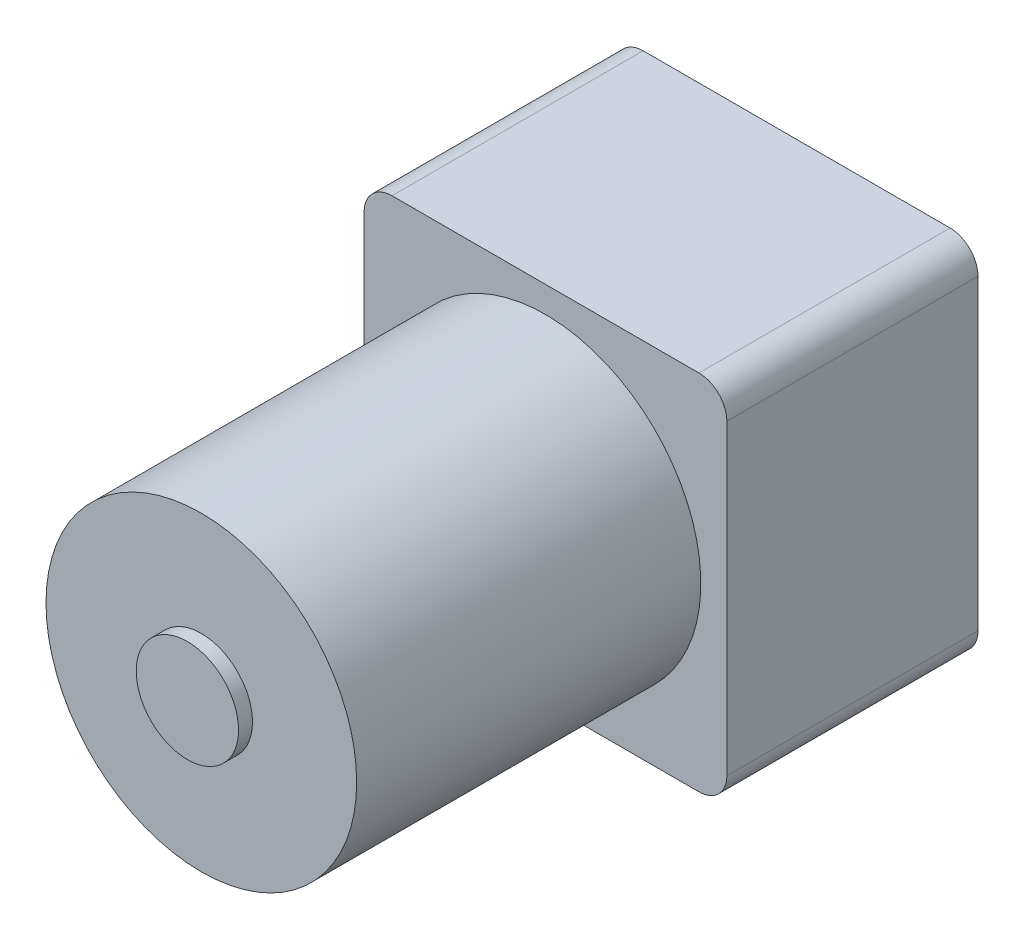
ISO-10303-21;
HEADER;
FILE_DESCRIPTION(('STEP AP214'),'2;1');
FILE_NAME('part.step','',(''),(''),'','','');
FILE_SCHEMA(('AUTOMOTIVE_DESIGN { 1 0 10303 214 1 1 1 1 }'));
ENDSEC;
DATA;
#1=APPLICATION_CONTEXT('core data for automotive mechanical design processes');
#2=APPLICATION_PROTOCOL_DEFINITION('international standard','automotive_design',2000,#1);
#3=PRODUCT_CONTEXT('',#1,'mechanical');
#4=PRODUCT('Part','Part','',(#3));
#5=PRODUCT_RELATED_PRODUCT_CATEGORY('part','',(#4));
#6=PRODUCT_DEFINITION_FORMATION('','',#4);
#7=PRODUCT_DEFINITION_CONTEXT('part definition',#1,'design');
#8=PRODUCT_DEFINITION('design','',#6,#7);
#9=PRODUCT_DEFINITION_SHAPE('','',#8);
#10=(LENGTH_UNIT() NAMED_UNIT(*) SI_UNIT(.MILLI.,.METRE.));
#11=(NAMED_UNIT(*) PLANE_ANGLE_UNIT() SI_UNIT($,.RADIAN.));
#12=(NAMED_UNIT(*) SI_UNIT($,.STERADIAN.) SOLID_ANGLE_UNIT());
#13=UNCERTAINTY_MEASURE_WITH_UNIT(LENGTH_MEASURE(1.E-05),#10,'distance_accuracy_value','');
#14=(GEOMETRIC_REPRESENTATION_CONTEXT(3) GLOBAL_UNCERTAINTY_ASSIGNED_CONTEXT((#13)) GLOBAL_UNIT_ASSIGNED_CONTEXT((#10,
#11,#12)) REPRESENTATION_CONTEXT('',''));
#15=CARTESIAN_POINT('',(0.,0.,0.));
#16=DIRECTION('',(0.,0.,1.));
#17=DIRECTION('',(1.,0.,0.));
#18=AXIS2_PLACEMENT_3D('',#15,#16,#17);
#19=CARTESIAN_POINT('',(-4.76353973810178,-2.44882978723404,-1.5));
#20=DIRECTION('',(0.,0.,-1.));
#21=DIRECTION('',(-1.,0.,0.));
#22=AXIS2_PLACEMENT_3D('',#19,#20,#21);
#23=PLANE('',#22);
#24=CARTESIAN_POINT('',(-4.76353973810178,-2.44882978723404,-1.5));
#25=DIRECTION('',(0.,0.,-1.));
#26=DIRECTION('',(-1.,0.,0.));
#27=AXIS2_PLACEMENT_3D('',#24,#25,#26);
#28=CIRCLE('',#27,5.5);
#29=CARTESIAN_POINT('',(-10.2635397381018,-2.44882978723404,-1.5));
#30=VERTEX_POINT('',#29);
#31=EDGE_CURVE('E212',#30,#30,#28,.T.);
#32=ORIENTED_EDGE('',*,*,#31,.T.);
#33=EDGE_LOOP('',(#32));
#34=FACE_BOUND('',#33,.T.);
#35=CARTESIAN_POINT('',(-4.76353973810177,-2.44882978723404,-1.5));
#36=DIRECTION('',(0.,0.,-1.));
#37=DIRECTION('',(-1.,0.,0.));
#38=AXIS2_PLACEMENT_3D('',#35,#36,#37);
#39=CIRCLE('',#38,2.);
#40=CARTESIAN_POINT('',(-6.76353973810177,-2.44882978723404,-1.5));
#41=VERTEX_POINT('',#40);
#42=EDGE_CURVE('E221',#41,#41,#39,.T.);
#43=ORIENTED_EDGE('',*,*,#42,.F.);
#44=EDGE_LOOP('',(#43));
#45=FACE_BOUND('',#44,.T.);
#46=ADVANCED_FACE('F30',(#34,#45),#23,.T.);
#47=CARTESIAN_POINT('',(11.7364602618982,14.051170212766,0.));
#48=DIRECTION('',(0.,0.,-1.));
#49=DIRECTION('',(-1.,0.,0.));
#50=AXIS2_PLACEMENT_3D('',#47,#48,#49);
#51=PLANE('',#50);
#52=CARTESIAN_POINT('',(11.7364602618982,14.051170212766,0.));
#53=DIRECTION('',(0.,0.,1.));
#54=DIRECTION('',(-1.,0.,0.));
#55=AXIS2_PLACEMENT_3D('',#52,#53,#54);
#56=CIRCLE('',#55,3.);
#57=CARTESIAN_POINT('',(14.7364602618982,14.0511702127659,0.));
#58=VERTEX_POINT('',#57);
#59=CARTESIAN_POINT('',(11.7364602618982,17.051170212766,0.));
#60=VERTEX_POINT('',#59);
#61=EDGE_CURVE('E129',#58,#60,#56,.T.);
#62=ORIENTED_EDGE('',*,*,#61,.F.);
#63=DIRECTION('',(0.,1.,0.));
#64=VECTOR('',#63,1.);
#65=CARTESIAN_POINT('',(14.7364602618982,14.0511702127659,0.));
#66=LINE('',#65,#64);
#67=CARTESIAN_POINT('',(14.7364602618982,-18.948829787234,0.));
#68=VERTEX_POINT('',#67);
#69=EDGE_CURVE('E82',#68,#58,#66,.T.);
#70=ORIENTED_EDGE('',*,*,#69,.F.);
#71=CARTESIAN_POINT('',(11.7364602618982,-18.948829787234,0.));
#72=DIRECTION('',(0.,0.,1.));
#73=DIRECTION('',(1.,0.,0.));
#74=AXIS2_PLACEMENT_3D('',#71,#72,#73);
#75=CIRCLE('',#74,3.);
#76=CARTESIAN_POINT('',(11.7364602618982,-21.948829787234,0.));
#77=VERTEX_POINT('',#76);
#78=EDGE_CURVE('E76',#77,#68,#75,.T.);
#79=ORIENTED_EDGE('',*,*,#78,.F.);
#80=DIRECTION('',(1.,0.,0.));
#81=VECTOR('',#80,1.);
#82=CARTESIAN_POINT('',(-21.2635397381018,-21.948829787234,0.));
#83=LINE('',#82,#81);
#84=CARTESIAN_POINT('',(-21.2635397381018,-21.948829787234,0.));
#85=VERTEX_POINT('',#84);
#86=EDGE_CURVE('E119',#85,#77,#83,.T.);
#87=ORIENTED_EDGE('',*,*,#86,.F.);
#88=CARTESIAN_POINT('',(-21.2635397381018,-18.948829787234,0.));
#89=DIRECTION('',(0.,0.,1.));
#90=DIRECTION('',(1.,0.,0.));
#91=AXIS2_PLACEMENT_3D('',#88,#89,#90);
#92=CIRCLE('',#91,3.);
#93=CARTESIAN_POINT('',(-24.2635397381018,-18.948829787234,0.));
#94=VERTEX_POINT('',#93);
#95=EDGE_CURVE('E139',#94,#85,#92,.T.);
#96=ORIENTED_EDGE('',*,*,#95,.F.);
#97=DIRECTION('',(0.,-1.,0.));
#98=VECTOR('',#97,1.);
#99=CARTESIAN_POINT('',(-24.2635397381018,14.0511702127659,0.));
#100=LINE('',#99,#98);
#101=CARTESIAN_POINT('',(-24.2635397381018,14.0511702127659,0.));
#102=VERTEX_POINT('',#101);
#103=EDGE_CURVE('E137',#102,#94,#100,.T.);
#104=ORIENTED_EDGE('',*,*,#103,.F.);
#105=CARTESIAN_POINT('',(-21.2635397381018,14.051170212766,0.));
#106=DIRECTION('',(0.,0.,1.));
#107=DIRECTION('',(1.,0.,0.));
#108=AXIS2_PLACEMENT_3D('',#105,#106,#107);
#109=CIRCLE('',#108,3.);
#110=CARTESIAN_POINT('',(-21.2635397381018,17.051170212766,0.));
#111=VERTEX_POINT('',#110);
#112=EDGE_CURVE('E135',#111,#102,#109,.T.);
#113=ORIENTED_EDGE('',*,*,#112,.F.);
#114=DIRECTION('',(-1.,0.,0.));
#115=VECTOR('',#114,1.);
#116=CARTESIAN_POINT('',(-21.2635397381018,17.051170212766,0.));
#117=LINE('',#116,#115);
#118=EDGE_CURVE('E132',#60,#111,#117,.T.);
#119=ORIENTED_EDGE('',*,*,#118,.F.);
#120=EDGE_LOOP('',(#62,#70,#79,#87,#96,#104,#113,#119));
#121=FACE_BOUND('',#120,.T.);
#122=CARTESIAN_POINT('',(11.2364602618982,13.551170212766,0.));
#123=DIRECTION('',(0.,0.,-1.));
#124=DIRECTION('',(-1.,0.,0.));
#125=AXIS2_PLACEMENT_3D('',#122,#123,#124);
#126=CIRCLE('',#125,1.35);
#127=CARTESIAN_POINT('',(9.88646026189822,13.551170212766,0.));
#128=VERTEX_POINT('',#127);
#129=EDGE_CURVE('E191',#128,#128,#126,.T.);
#130=ORIENTED_EDGE('',*,*,#129,.F.);
#131=EDGE_LOOP('',(#130));
#132=FACE_BOUND('',#131,.T.);
#133=CARTESIAN_POINT('',(-20.7635397381018,13.551170212766,0.));
#134=DIRECTION('',(0.,0.,-1.));
#135=DIRECTION('',(-1.,0.,0.));
#136=AXIS2_PLACEMENT_3D('',#133,#134,#135);
#137=CIRCLE('',#136,1.35);
#138=CARTESIAN_POINT('',(-22.1135397381018,13.551170212766,0.));
#139=VERTEX_POINT('',#138);
#140=EDGE_CURVE('E197',#139,#139,#137,.T.);
#141=ORIENTED_EDGE('',*,*,#140,.F.);
#142=EDGE_LOOP('',(#141));
#143=FACE_BOUND('',#142,.T.);
#144=CARTESIAN_POINT('',(-20.7635397381018,-18.448829787234,0.));
#145=DIRECTION('',(0.,0.,-1.));
#146=DIRECTION('',(-1.,0.,0.));
#147=AXIS2_PLACEMENT_3D('',#144,#145,#146);
#148=CIRCLE('',#147,1.35);
#149=CARTESIAN_POINT('',(-22.1135397381018,-18.448829787234,0.));
#150=VERTEX_POINT('',#149);
#151=EDGE_CURVE('E203',#150,#150,#148,.T.);
#152=ORIENTED_EDGE('',*,*,#151,.F.);
#153=EDGE_LOOP('',(#152));
#154=FACE_BOUND('',#153,.T.);
#155=CARTESIAN_POINT('',(11.2364602618982,-18.448829787234,0.));
#156=DIRECTION('',(0.,0.,-1.));
#157=DIRECTION('',(-1.,0.,0.));
#158=AXIS2_PLACEMENT_3D('',#155,#156,#157);
#159=CIRCLE('',#158,1.35);
#160=CARTESIAN_POINT('',(9.88646026189822,-18.448829787234,0.));
#161=VERTEX_POINT('',#160);
#162=EDGE_CURVE('E209',#161,#161,#159,.T.);
#163=ORIENTED_EDGE('',*,*,#162,.F.);
#164=EDGE_LOOP('',(#163));
#165=FACE_BOUND('',#164,.T.);
#166=CARTESIAN_POINT('',(-4.76353973810178,-2.44882978723404,0.));
#167=DIRECTION('',(0.,0.,-1.));
#168=DIRECTION('',(-1.,0.,0.));
#169=AXIS2_PLACEMENT_3D('',#166,#167,#168);
#170=CIRCLE('',#169,5.5);
#171=CARTESIAN_POINT('',(-10.2635397381018,-2.44882978723404,0.));
#172=VERTEX_POINT('',#171);
#173=EDGE_CURVE('E215',#172,#172,#170,.T.);
#174=ORIENTED_EDGE('',*,*,#173,.F.);
#175=EDGE_LOOP('',(#174));
#176=FACE_BOUND('',#175,.T.);
#177=ADVANCED_FACE('F162',(#121,#132,#143,#154,#165,#176),#51,.T.);
#178=CARTESIAN_POINT('',(-4.76353973810178,-2.44882978723404,64.));
#179=DIRECTION('',(0.,0.,1.));
#180=DIRECTION('',(1.,0.,0.));
#181=AXIS2_PLACEMENT_3D('',#178,#179,#180);
#182=PLANE('',#181);
#183=CARTESIAN_POINT('',(-4.76353973810178,-2.44882978723404,64.));
#184=DIRECTION('',(0.,0.,1.));
#185=DIRECTION('',(1.,0.,0.));
#186=AXIS2_PLACEMENT_3D('',#183,#184,#185);
#187=CIRCLE('',#186,16.7);
#188=CARTESIAN_POINT('',(11.9364602618982,-2.44882978723404,64.));
#189=VERTEX_POINT('',#188);
#190=EDGE_CURVE('E133',#189,#189,#187,.T.);
#191=ORIENTED_EDGE('',*,*,#190,.T.);
#192=EDGE_LOOP('',(#191));
#193=FACE_BOUND('',#192,.T.);
#194=CARTESIAN_POINT('',(-4.76353973810178,-2.44882978723404,64.));
#195=DIRECTION('',(0.,0.,1.));
#196=DIRECTION('',(1.,0.,0.));
#197=AXIS2_PLACEMENT_3D('',#194,#195,#196);
#198=CIRCLE('',#197,5.5);
#199=CARTESIAN_POINT('',(0.736460261898225,-2.44882978723404,64.));
#200=VERTEX_POINT('',#199);
#201=EDGE_CURVE('E185',#200,#200,#198,.T.);
#202=ORIENTED_EDGE('',*,*,#201,.F.);
#203=EDGE_LOOP('',(#202));
#204=FACE_BOUND('',#203,.T.);
#205=ADVANCED_FACE('F242',(#193,#204),#182,.T.);
#206=CARTESIAN_POINT('',(11.7364602618982,14.051170212766,27.));
#207=DIRECTION('',(0.,0.,-1.));
#208=DIRECTION('',(-1.,0.,0.));
#209=AXIS2_PLACEMENT_3D('',#206,#207,#208);
#210=PLANE('',#209);
#211=CARTESIAN_POINT('',(11.7364602618982,14.051170212766,27.));
#212=DIRECTION('',(0.,0.,1.));
#213=DIRECTION('',(-1.,0.,0.));
#214=AXIS2_PLACEMENT_3D('',#211,#212,#213);
#215=CIRCLE('',#214,3.);
#216=CARTESIAN_POINT('',(14.7364602618982,14.0511702127659,27.));
#217=VERTEX_POINT('',#216);
#218=CARTESIAN_POINT('',(11.7364602618982,17.051170212766,27.));
#219=VERTEX_POINT('',#218);
#220=EDGE_CURVE('E144',#217,#219,#215,.T.);
#221=ORIENTED_EDGE('',*,*,#220,.T.);
#222=DIRECTION('',(-1.,0.,0.));
#223=VECTOR('',#222,1.);
#224=CARTESIAN_POINT('',(-21.2635397381018,17.051170212766,27.));
#225=LINE('',#224,#223);
#226=CARTESIAN_POINT('',(-21.2635397381018,17.051170212766,27.));
#227=VERTEX_POINT('',#226);
#228=EDGE_CURVE('E91',#219,#227,#225,.T.);
#229=ORIENTED_EDGE('',*,*,#228,.T.);
#230=CARTESIAN_POINT('',(-21.2635397381018,14.051170212766,27.));
#231=DIRECTION('',(0.,0.,1.));
#232=DIRECTION('',(1.,0.,0.));
#233=AXIS2_PLACEMENT_3D('',#230,#231,#232);
#234=CIRCLE('',#233,3.);
#235=CARTESIAN_POINT('',(-24.2635397381018,14.0511702127659,27.));
#236=VERTEX_POINT('',#235);
#237=EDGE_CURVE('E176',#227,#236,#234,.T.);
#238=ORIENTED_EDGE('',*,*,#237,.T.);
#239=DIRECTION('',(0.,-1.,0.));
#240=VECTOR('',#239,1.);
#241=CARTESIAN_POINT('',(-24.2635397381018,14.0511702127659,27.));
#242=LINE('',#241,#240);
#243=CARTESIAN_POINT('',(-24.2635397381018,-18.948829787234,27.));
#244=VERTEX_POINT('',#243);
#245=EDGE_CURVE('E175',#236,#244,#242,.T.);
#246=ORIENTED_EDGE('',*,*,#245,.T.);
#247=CARTESIAN_POINT('',(-21.2635397381018,-18.948829787234,27.));
#248=DIRECTION('',(0.,0.,1.));
#249=DIRECTION('',(1.,0.,0.));
#250=AXIS2_PLACEMENT_3D('',#247,#248,#249);
#251=CIRCLE('',#250,3.);
#252=CARTESIAN_POINT('',(-21.2635397381018,-21.948829787234,27.));
#253=VERTEX_POINT('',#252);
#254=EDGE_CURVE('E111',#244,#253,#251,.T.);
#255=ORIENTED_EDGE('',*,*,#254,.T.);
#256=DIRECTION('',(1.,0.,0.));
#257=VECTOR('',#256,1.);
#258=CARTESIAN_POINT('',(-21.2635397381018,-21.948829787234,27.));
#259=LINE('',#258,#257);
#260=CARTESIAN_POINT('',(11.7364602618982,-21.948829787234,27.));
#261=VERTEX_POINT('',#260);
#262=EDGE_CURVE('E104',#253,#261,#259,.T.);
#263=ORIENTED_EDGE('',*,*,#262,.T.);
#264=CARTESIAN_POINT('',(11.7364602618982,-18.948829787234,27.));
#265=DIRECTION('',(0.,0.,1.));
#266=DIRECTION('',(1.,0.,0.));
#267=AXIS2_PLACEMENT_3D('',#264,#265,#266);
#268=CIRCLE('',#267,3.);
#269=CARTESIAN_POINT('',(14.7364602618982,-18.948829787234,27.));
#270=VERTEX_POINT('',#269);
#271=EDGE_CURVE('E109',#261,#270,#268,.T.);
#272=ORIENTED_EDGE('',*,*,#271,.T.);
#273=DIRECTION('',(0.,1.,0.));
#274=VECTOR('',#273,1.);
#275=CARTESIAN_POINT('',(14.7364602618982,14.0511702127659,27.));
#276=LINE('',#275,#274);
#277=EDGE_CURVE('E47',#270,#217,#276,.T.);
#278=ORIENTED_EDGE('',*,*,#277,.T.);
#279=EDGE_LOOP('',(#221,#229,#238,#246,#255,#263,#272,#278));
#280=FACE_BOUND('',#279,.T.);
#281=CARTESIAN_POINT('',(-4.76353973810178,-2.44882978723404,27.));
#282=DIRECTION('',(0.,0.,-1.));
#283=DIRECTION('',(-1.,0.,0.));
#284=AXIS2_PLACEMENT_3D('',#281,#282,#283);
#285=CIRCLE('',#284,16.7);
#286=CARTESIAN_POINT('',(-21.4635397381018,-2.44882978723404,27.));
#287=VERTEX_POINT('',#286);
#288=EDGE_CURVE('E11',#287,#287,#285,.F.);
#289=ORIENTED_EDGE('',*,*,#288,.F.);
#290=EDGE_LOOP('',(#289));
#291=FACE_BOUND('',#290,.T.);
#292=ADVANCED_FACE('F106',(#280,#291),#210,.F.);
#293=CARTESIAN_POINT('',(11.7364602618982,14.051170212766,27.));
#294=DIRECTION('',(0.,0.,-1.));
#295=DIRECTION('',(-1.,0.,0.));
#296=AXIS2_PLACEMENT_3D('',#293,#294,#295);
#297=CYLINDRICAL_SURFACE('',#296,3.);
#298=ORIENTED_EDGE('',*,*,#61,.T.);
#299=DIRECTION('',(0.,0.,-1.));
#300=VECTOR('',#299,1.);
#301=CARTESIAN_POINT('',(11.7364602618982,17.051170212766,27.));
#302=LINE('',#301,#300);
#303=EDGE_CURVE('E39',#219,#60,#302,.T.);
#304=ORIENTED_EDGE('',*,*,#303,.F.);
#305=ORIENTED_EDGE('',*,*,#220,.F.);
#306=DIRECTION('',(0.,0.,-1.));
#307=VECTOR('',#306,1.);
#308=CARTESIAN_POINT('',(14.7364602618982,14.0511702127659,27.));
#309=LINE('',#308,#307);
#310=EDGE_CURVE('E125',#217,#58,#309,.T.);
#311=ORIENTED_EDGE('',*,*,#310,.T.);
#312=EDGE_LOOP('',(#298,#304,#305,#311));
#313=FACE_BOUND('',#312,.T.);
#314=ADVANCED_FACE('F32',(#313),#297,.T.);
#315=CARTESIAN_POINT('',(-21.2635397381018,17.051170212766,27.));
#316=DIRECTION('',(0.,-1.,0.));
#317=DIRECTION('',(0.,0.,-1.));
#318=AXIS2_PLACEMENT_3D('',#315,#316,#317);
#319=PLANE('',#318);
#320=ORIENTED_EDGE('',*,*,#118,.T.);
#321=DIRECTION('',(0.,0.,-1.));
#322=VECTOR('',#321,1.);
#323=CARTESIAN_POINT('',(-21.2635397381018,17.051170212766,27.));
#324=LINE('',#323,#322);
#325=EDGE_CURVE('E154',#227,#111,#324,.T.);
#326=ORIENTED_EDGE('',*,*,#325,.F.);
#327=ORIENTED_EDGE('',*,*,#228,.F.);
#328=ORIENTED_EDGE('',*,*,#303,.T.);
#329=EDGE_LOOP('',(#320,#326,#327,#328));
#330=FACE_BOUND('',#329,.T.);
#331=ADVANCED_FACE('F157',(#330),#319,.F.);
#332=CARTESIAN_POINT('',(-21.2635397381018,14.051170212766,27.));
#333=DIRECTION('',(0.,0.,-1.));
#334=DIRECTION('',(-1.,0.,0.));
#335=AXIS2_PLACEMENT_3D('',#332,#333,#334);
#336=CYLINDRICAL_SURFACE('',#335,3.);
#337=ORIENTED_EDGE('',*,*,#112,.T.);
#338=DIRECTION('',(0.,0.,-1.));
#339=VECTOR('',#338,1.);
#340=CARTESIAN_POINT('',(-24.2635397381018,14.0511702127659,27.));
#341=LINE('',#340,#339);
#342=EDGE_CURVE('E151',#236,#102,#341,.T.);
#343=ORIENTED_EDGE('',*,*,#342,.F.);
#344=ORIENTED_EDGE('',*,*,#237,.F.);
#345=ORIENTED_EDGE('',*,*,#325,.T.);
#346=EDGE_LOOP('',(#337,#343,#344,#345));
#347=FACE_BOUND('',#346,.T.);
#348=ADVANCED_FACE('F169',(#347),#336,.T.);
#349=CARTESIAN_POINT('',(-24.2635397381018,14.0511702127659,27.));
#350=DIRECTION('',(1.,0.,0.));
#351=DIRECTION('',(0.,1.,0.));
#352=AXIS2_PLACEMENT_3D('',#349,#350,#351);
#353=PLANE('',#352);
#354=ORIENTED_EDGE('',*,*,#103,.T.);
#355=DIRECTION('',(0.,0.,-1.));
#356=VECTOR('',#355,1.);
#357=CARTESIAN_POINT('',(-24.2635397381018,-18.948829787234,27.));
#358=LINE('',#357,#356);
#359=EDGE_CURVE('E148',#244,#94,#358,.T.);
#360=ORIENTED_EDGE('',*,*,#359,.F.);
#361=ORIENTED_EDGE('',*,*,#245,.F.);
#362=ORIENTED_EDGE('',*,*,#342,.T.);
#363=EDGE_LOOP('',(#354,#360,#361,#362));
#364=FACE_BOUND('',#363,.T.);
#365=ADVANCED_FACE('F173',(#364),#353,.F.);
#366=CARTESIAN_POINT('',(-21.2635397381018,-18.948829787234,27.));
#367=DIRECTION('',(0.,0.,-1.));
#368=DIRECTION('',(-1.,0.,0.));
#369=AXIS2_PLACEMENT_3D('',#366,#367,#368);
#370=CYLINDRICAL_SURFACE('',#369,3.);
#371=ORIENTED_EDGE('',*,*,#95,.T.);
#372=DIRECTION('',(0.,0.,-1.));
#373=VECTOR('',#372,1.);
#374=CARTESIAN_POINT('',(-21.2635397381018,-21.948829787234,27.));
#375=LINE('',#374,#373);
#376=EDGE_CURVE('E120',#253,#85,#375,.T.);
#377=ORIENTED_EDGE('',*,*,#376,.F.);
#378=ORIENTED_EDGE('',*,*,#254,.F.);
#379=ORIENTED_EDGE('',*,*,#359,.T.);
#380=EDGE_LOOP('',(#371,#377,#378,#379));
#381=FACE_BOUND('',#380,.T.);
#382=ADVANCED_FACE('F305',(#381),#370,.T.);
#383=CARTESIAN_POINT('',(-21.2635397381018,-21.948829787234,27.));
#384=DIRECTION('',(0.,1.,0.));
#385=DIRECTION('',(-1.,0.,0.));
#386=AXIS2_PLACEMENT_3D('',#383,#384,#385);
#387=PLANE('',#386);
#388=ORIENTED_EDGE('',*,*,#86,.T.);
#389=DIRECTION('',(0.,0.,-1.));
#390=VECTOR('',#389,1.);
#391=CARTESIAN_POINT('',(11.7364602618982,-21.948829787234,27.));
#392=LINE('',#391,#390);
#393=EDGE_CURVE('E116',#261,#77,#392,.T.);
#394=ORIENTED_EDGE('',*,*,#393,.F.);
#395=ORIENTED_EDGE('',*,*,#262,.F.);
#396=ORIENTED_EDGE('',*,*,#376,.T.);
#397=EDGE_LOOP('',(#388,#394,#395,#396));
#398=FACE_BOUND('',#397,.T.);
#399=ADVANCED_FACE('F117',(#398),#387,.F.);
#400=CARTESIAN_POINT('',(11.7364602618982,-18.948829787234,27.));
#401=DIRECTION('',(0.,0.,-1.));
#402=DIRECTION('',(-1.,0.,0.));
#403=AXIS2_PLACEMENT_3D('',#400,#401,#402);
#404=CYLINDRICAL_SURFACE('',#403,3.);
#405=ORIENTED_EDGE('',*,*,#78,.T.);
#406=DIRECTION('',(0.,0.,-1.));
#407=VECTOR('',#406,1.);
#408=CARTESIAN_POINT('',(14.7364602618982,-18.948829787234,27.));
#409=LINE('',#408,#407);
#410=EDGE_CURVE('E121',#270,#68,#409,.T.);
#411=ORIENTED_EDGE('',*,*,#410,.F.);
#412=ORIENTED_EDGE('',*,*,#271,.F.);
#413=ORIENTED_EDGE('',*,*,#393,.T.);
#414=EDGE_LOOP('',(#405,#411,#412,#413));
#415=FACE_BOUND('',#414,.T.);
#416=ADVANCED_FACE('F123',(#415),#404,.T.);
#417=CARTESIAN_POINT('',(14.7364602618982,14.0511702127659,27.));
#418=DIRECTION('',(-1.,0.,0.));
#419=DIRECTION('',(0.,-1.,0.));
#420=AXIS2_PLACEMENT_3D('',#417,#418,#419);
#421=PLANE('',#420);
#422=ORIENTED_EDGE('',*,*,#69,.T.);
#423=ORIENTED_EDGE('',*,*,#310,.F.);
#424=ORIENTED_EDGE('',*,*,#277,.F.);
#425=ORIENTED_EDGE('',*,*,#410,.T.);
#426=EDGE_LOOP('',(#422,#423,#424,#425));
#427=FACE_BOUND('',#426,.T.);
#428=ADVANCED_FACE('F295',(#427),#421,.F.);
#429=CARTESIAN_POINT('',(-4.76353973810178,-2.44882978723404,64.));
#430=DIRECTION('',(0.,0.,-1.));
#431=DIRECTION('',(-1.,0.,0.));
#432=AXIS2_PLACEMENT_3D('',#429,#430,#431);
#433=CYLINDRICAL_SURFACE('',#432,16.7);
#434=ORIENTED_EDGE('',*,*,#190,.F.);
#435=EDGE_LOOP('',(#434));
#436=FACE_BOUND('',#435,.T.);
#437=ORIENTED_EDGE('',*,*,#288,.T.);
#438=EDGE_LOOP('',(#437));
#439=FACE_BOUND('',#438,.T.);
#440=ADVANCED_FACE('F288',(#436,#439),#433,.T.);
#441=CARTESIAN_POINT('',(-4.76353973810178,-2.44882978723404,65.5));
#442=DIRECTION('',(0.,0.,-1.));
#443=DIRECTION('',(-1.,0.,0.));
#444=AXIS2_PLACEMENT_3D('',#441,#442,#443);
#445=CYLINDRICAL_SURFACE('',#444,5.5);
#446=CARTESIAN_POINT('',(-4.76353973810178,-2.44882978723404,65.5));
#447=DIRECTION('',(0.,0.,1.));
#448=DIRECTION('',(1.,0.,0.));
#449=AXIS2_PLACEMENT_3D('',#446,#447,#448);
#450=CIRCLE('',#449,5.5);
#451=CARTESIAN_POINT('',(0.736460261898225,-2.44882978723404,65.5));
#452=VERTEX_POINT('',#451);
#453=EDGE_CURVE('E184',#452,#452,#450,.T.);
#454=ORIENTED_EDGE('',*,*,#453,.F.);
#455=EDGE_LOOP('',(#454));
#456=FACE_BOUND('',#455,.T.);
#457=ORIENTED_EDGE('',*,*,#201,.T.);
#458=EDGE_LOOP('',(#457));
#459=FACE_BOUND('',#458,.T.);
#460=ADVANCED_FACE('F284',(#456,#459),#445,.T.);
#461=CARTESIAN_POINT('',(-4.76353973810178,-2.44882978723404,65.5));
#462=DIRECTION('',(0.,0.,1.));
#463=DIRECTION('',(1.,0.,0.));
#464=AXIS2_PLACEMENT_3D('',#461,#462,#463);
#465=PLANE('',#464);
#466=ORIENTED_EDGE('',*,*,#453,.T.);
#467=EDGE_LOOP('',(#466));
#468=FACE_BOUND('',#467,.T.);
#469=ADVANCED_FACE('F280',(#468),#465,.T.);
#470=CARTESIAN_POINT('',(11.2364602618982,13.551170212766,10.));
#471=DIRECTION('',(0.,0.,-1.));
#472=DIRECTION('',(-1.,0.,0.));
#473=AXIS2_PLACEMENT_3D('',#470,#471,#472);
#474=CYLINDRICAL_SURFACE('',#473,1.35);
#475=CARTESIAN_POINT('',(11.2364602618982,13.551170212766,10.));
#476=DIRECTION('',(0.,0.,-1.));
#477=DIRECTION('',(-1.,0.,0.));
#478=AXIS2_PLACEMENT_3D('',#475,#476,#477);
#479=CIRCLE('',#478,1.35);
#480=CARTESIAN_POINT('',(9.88646026189822,13.551170212766,10.));
#481=VERTEX_POINT('',#480);
#482=EDGE_CURVE('E188',#481,#481,#479,.T.);
#483=ORIENTED_EDGE('',*,*,#482,.F.);
#484=EDGE_LOOP('',(#483));
#485=FACE_BOUND('',#484,.T.);
#486=ORIENTED_EDGE('',*,*,#129,.T.);
#487=EDGE_LOOP('',(#486));
#488=FACE_BOUND('',#487,.T.);
#489=ADVANCED_FACE('F276',(#485,#488),#474,.F.);
#490=CARTESIAN_POINT('',(11.2364602618982,13.551170212766,10.));
#491=DIRECTION('',(0.,0.,-1.));
#492=DIRECTION('',(-1.,0.,0.));
#493=AXIS2_PLACEMENT_3D('',#490,#491,#492);
#494=PLANE('',#493);
#495=ORIENTED_EDGE('',*,*,#482,.T.);
#496=EDGE_LOOP('',(#495));
#497=FACE_BOUND('',#496,.T.);
#498=ADVANCED_FACE('F272',(#497),#494,.T.);
#499=CARTESIAN_POINT('',(-20.7635397381018,13.551170212766,10.));
#500=DIRECTION('',(0.,0.,-1.));
#501=DIRECTION('',(-1.,0.,0.));
#502=AXIS2_PLACEMENT_3D('',#499,#500,#501);
#503=CYLINDRICAL_SURFACE('',#502,1.35);
#504=CARTESIAN_POINT('',(-20.7635397381018,13.551170212766,10.));
#505=DIRECTION('',(0.,0.,-1.));
#506=DIRECTION('',(-1.,0.,0.));
#507=AXIS2_PLACEMENT_3D('',#504,#505,#506);
#508=CIRCLE('',#507,1.35);
#509=CARTESIAN_POINT('',(-22.1135397381018,13.551170212766,10.));
#510=VERTEX_POINT('',#509);
#511=EDGE_CURVE('E194',#510,#510,#508,.T.);
#512=ORIENTED_EDGE('',*,*,#511,.F.);
#513=EDGE_LOOP('',(#512));
#514=FACE_BOUND('',#513,.T.);
#515=ORIENTED_EDGE('',*,*,#140,.T.);
#516=EDGE_LOOP('',(#515));
#517=FACE_BOUND('',#516,.T.);
#518=ADVANCED_FACE('F268',(#514,#517),#503,.F.);
#519=CARTESIAN_POINT('',(-20.7635397381018,13.551170212766,10.));
#520=DIRECTION('',(0.,0.,-1.));
#521=DIRECTION('',(-1.,0.,0.));
#522=AXIS2_PLACEMENT_3D('',#519,#520,#521);
#523=PLANE('',#522);
#524=ORIENTED_EDGE('',*,*,#511,.T.);
#525=EDGE_LOOP('',(#524));
#526=FACE_BOUND('',#525,.T.);
#527=ADVANCED_FACE('F264',(#526),#523,.T.);
#528=CARTESIAN_POINT('',(-20.7635397381018,-18.448829787234,10.));
#529=DIRECTION('',(0.,0.,-1.));
#530=DIRECTION('',(-1.,0.,0.));
#531=AXIS2_PLACEMENT_3D('',#528,#529,#530);
#532=CYLINDRICAL_SURFACE('',#531,1.35);
#533=CARTESIAN_POINT('',(-20.7635397381018,-18.448829787234,10.));
#534=DIRECTION('',(0.,0.,-1.));
#535=DIRECTION('',(-1.,0.,0.));
#536=AXIS2_PLACEMENT_3D('',#533,#534,#535);
#537=CIRCLE('',#536,1.35);
#538=CARTESIAN_POINT('',(-22.1135397381018,-18.448829787234,10.));
#539=VERTEX_POINT('',#538);
#540=EDGE_CURVE('E200',#539,#539,#537,.T.);
#541=ORIENTED_EDGE('',*,*,#540,.F.);
#542=EDGE_LOOP('',(#541));
#543=FACE_BOUND('',#542,.T.);
#544=ORIENTED_EDGE('',*,*,#151,.T.);
#545=EDGE_LOOP('',(#544));
#546=FACE_BOUND('',#545,.T.);
#547=ADVANCED_FACE('F260',(#543,#546),#532,.F.);
#548=CARTESIAN_POINT('',(-20.7635397381018,-18.448829787234,10.));
#549=DIRECTION('',(0.,0.,-1.));
#550=DIRECTION('',(-1.,0.,0.));
#551=AXIS2_PLACEMENT_3D('',#548,#549,#550);
#552=PLANE('',#551);
#553=ORIENTED_EDGE('',*,*,#540,.T.);
#554=EDGE_LOOP('',(#553));
#555=FACE_BOUND('',#554,.T.);
#556=ADVANCED_FACE('F256',(#555),#552,.T.);
#557=CARTESIAN_POINT('',(11.2364602618982,-18.448829787234,10.));
#558=DIRECTION('',(0.,0.,-1.));
#559=DIRECTION('',(-1.,0.,0.));
#560=AXIS2_PLACEMENT_3D('',#557,#558,#559);
#561=CYLINDRICAL_SURFACE('',#560,1.35);
#562=CARTESIAN_POINT('',(11.2364602618982,-18.448829787234,10.));
#563=DIRECTION('',(0.,0.,-1.));
#564=DIRECTION('',(-1.,0.,0.));
#565=AXIS2_PLACEMENT_3D('',#562,#563,#564);
#566=CIRCLE('',#565,1.35);
#567=CARTESIAN_POINT('',(9.88646026189822,-18.448829787234,10.));
#568=VERTEX_POINT('',#567);
#569=EDGE_CURVE('E206',#568,#568,#566,.T.);
#570=ORIENTED_EDGE('',*,*,#569,.F.);
#571=EDGE_LOOP('',(#570));
#572=FACE_BOUND('',#571,.T.);
#573=ORIENTED_EDGE('',*,*,#162,.T.);
#574=EDGE_LOOP('',(#573));
#575=FACE_BOUND('',#574,.T.);
#576=ADVANCED_FACE('F252',(#572,#575),#561,.F.);
#577=CARTESIAN_POINT('',(11.2364602618982,-18.448829787234,10.));
#578=DIRECTION('',(0.,0.,-1.));
#579=DIRECTION('',(-1.,0.,0.));
#580=AXIS2_PLACEMENT_3D('',#577,#578,#579);
#581=PLANE('',#580);
#582=ORIENTED_EDGE('',*,*,#569,.T.);
#583=EDGE_LOOP('',(#582));
#584=FACE_BOUND('',#583,.T.);
#585=ADVANCED_FACE('F248',(#584),#581,.T.);
#586=CARTESIAN_POINT('',(-4.76353973810178,-2.44882978723404,-1.5));
#587=DIRECTION('',(0.,0.,1.));
#588=DIRECTION('',(1.,0.,0.));
#589=AXIS2_PLACEMENT_3D('',#586,#587,#588);
#590=CYLINDRICAL_SURFACE('',#589,5.5);
#591=ORIENTED_EDGE('',*,*,#31,.F.);
#592=EDGE_LOOP('',(#591));
#593=FACE_BOUND('',#592,.T.);
#594=ORIENTED_EDGE('',*,*,#173,.T.);
#595=EDGE_LOOP('',(#594));
#596=FACE_BOUND('',#595,.T.);
#597=ADVANCED_FACE('F232',(#593,#596),#590,.T.);
#598=CARTESIAN_POINT('',(-4.76353973810177,-2.44882978723404,-10.));
#599=DIRECTION('',(0.,0.,1.));
#600=DIRECTION('',(1.,0.,0.));
#601=AXIS2_PLACEMENT_3D('',#598,#599,#600);
#602=CYLINDRICAL_SURFACE('',#601,2.);
#603=CARTESIAN_POINT('',(-4.76353973810177,-2.44882978723404,-10.));
#604=DIRECTION('',(0.,0.,-1.));
#605=DIRECTION('',(-1.,0.,0.));
#606=AXIS2_PLACEMENT_3D('',#603,#604,#605);
#607=CIRCLE('',#606,2.);
#608=CARTESIAN_POINT('',(-6.76353973810177,-2.44882978723404,-10.));
#609=VERTEX_POINT('',#608);
#610=EDGE_CURVE('E218',#609,#609,#607,.T.);
#611=ORIENTED_EDGE('',*,*,#610,.F.);
#612=EDGE_LOOP('',(#611));
#613=FACE_BOUND('',#612,.T.);
#614=ORIENTED_EDGE('',*,*,#42,.T.);
#615=EDGE_LOOP('',(#614));
#616=FACE_BOUND('',#615,.T.);
#617=ADVANCED_FACE('F229',(#613,#616),#602,.T.);
#618=CARTESIAN_POINT('',(-4.76353973810177,-2.44882978723404,-10.));
#619=DIRECTION('',(0.,0.,-1.));
#620=DIRECTION('',(-1.,0.,0.));
#621=AXIS2_PLACEMENT_3D('',#618,#619,#620);
#622=PLANE('',#621);
#623=ORIENTED_EDGE('',*,*,#610,.T.);
#624=EDGE_LOOP('',(#623));
#625=FACE_BOUND('',#624,.T.);
#626=ADVANCED_FACE('F227',(#625),#622,.T.);
#627=CLOSED_SHELL('',(#46,#177,#205,#292,#314,#331,#348,#365,#382,#399,#416,#428,#440,#460,#469,
#489,#498,#518,#527,#547,#556,#576,#585,#597,#617,#626));
#628=MANIFOLD_SOLID_BREP('B2',#627);
#629=ADVANCED_BREP_SHAPE_REPRESENTATION('',(#18,#628),#14);
#630=SHAPE_DEFINITION_REPRESENTATION(#9,#629);
ENDSEC;
END-ISO-10303-21;
